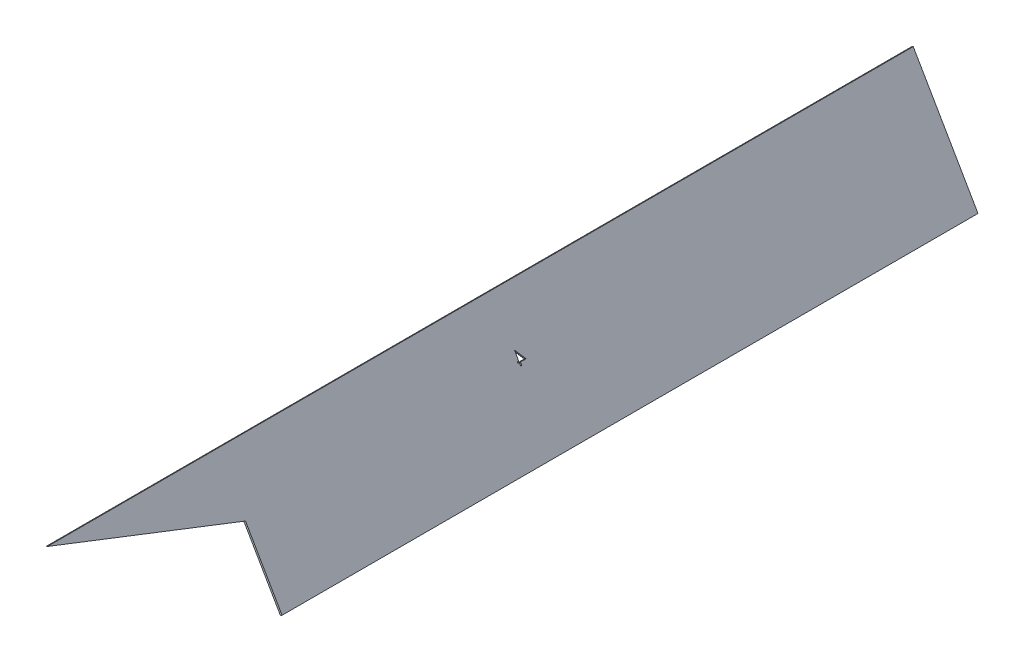
ISO-10303-21;
HEADER;
FILE_DESCRIPTION(('STEP AP214'),'2;1');
FILE_NAME('part.step','',(''),(''),'','','');
FILE_SCHEMA(('AUTOMOTIVE_DESIGN { 1 0 10303 214 1 1 1 1 }'));
ENDSEC;
DATA;
#1=APPLICATION_CONTEXT('core data for automotive mechanical design processes');
#2=APPLICATION_PROTOCOL_DEFINITION('international standard','automotive_design',2000,#1);
#3=PRODUCT_CONTEXT('',#1,'mechanical');
#4=PRODUCT('Part','Part','',(#3));
#5=PRODUCT_RELATED_PRODUCT_CATEGORY('part','',(#4));
#6=PRODUCT_DEFINITION_FORMATION('','',#4);
#7=PRODUCT_DEFINITION_CONTEXT('part definition',#1,'design');
#8=PRODUCT_DEFINITION('design','',#6,#7);
#9=PRODUCT_DEFINITION_SHAPE('','',#8);
#10=(LENGTH_UNIT() NAMED_UNIT(*) SI_UNIT(.MILLI.,.METRE.));
#11=(NAMED_UNIT(*) PLANE_ANGLE_UNIT() SI_UNIT($,.RADIAN.));
#12=(NAMED_UNIT(*) SI_UNIT($,.STERADIAN.) SOLID_ANGLE_UNIT());
#13=UNCERTAINTY_MEASURE_WITH_UNIT(LENGTH_MEASURE(1.E-05),#10,'distance_accuracy_value','');
#14=(GEOMETRIC_REPRESENTATION_CONTEXT(3) GLOBAL_UNCERTAINTY_ASSIGNED_CONTEXT((#13)) GLOBAL_UNIT_ASSIGNED_CONTEXT((#10,
#11,#12)) REPRESENTATION_CONTEXT('',''));
#15=CARTESIAN_POINT('',(0.,0.,0.));
#16=DIRECTION('',(0.,0.,1.));
#17=DIRECTION('',(1.,0.,0.));
#18=AXIS2_PLACEMENT_3D('',#15,#16,#17);
#19=CARTESIAN_POINT('',(-67.0289758800938,116.097591803631,-17.4864379112932));
#20=DIRECTION('',(0.,0.,1.));
#21=DIRECTION('',(0.500000000000001,-0.866025403784438,0.));
#22=AXIS2_PLACEMENT_3D('',#19,#20,#21);
#23=PLANE('',#22);
#24=DIRECTION('',(-0.866025403784438,-0.500000000000001,0.));
#25=VECTOR('',#24,1.);
#26=CARTESIAN_POINT('',(-67.0289758800938,116.097591803631,-17.4864379112932));
#27=LINE('',#26,#25);
#28=CARTESIAN_POINT('',(-64.2793452230782,117.685091803631,-17.4864379112931));
#29=VERTEX_POINT('',#28);
#30=CARTESIAN_POINT('',(-67.0289758800938,116.097591803631,-17.4864379112932));
#31=VERTEX_POINT('',#30);
#32=EDGE_CURVE('E11',#29,#31,#27,.T.);
#33=ORIENTED_EDGE('',*,*,#32,.F.);
#34=DIRECTION('',(-0.500000000000001,0.866025403784438,0.));
#35=VECTOR('',#34,1.);
#36=CARTESIAN_POINT('',(2.74963065701559,1.5875,-17.4864379112931));
#37=LINE('',#36,#35);
#38=CARTESIAN_POINT('',(-57.6851144538474,106.263549074489,-17.4864379112931));
#39=VERTEX_POINT('',#38);
#40=EDGE_CURVE('E145',#29,#39,#37,.F.);
#41=ORIENTED_EDGE('',*,*,#40,.T.);
#42=DIRECTION('',(-0.866025403784438,-0.500000000000001,0.));
#43=VECTOR('',#42,1.);
#44=CARTESIAN_POINT('',(-60.434745110863,104.676049074489,-17.4864379112932));
#45=LINE('',#44,#43);
#46=CARTESIAN_POINT('',(-60.434745110863,104.676049074489,-17.4864379112932));
#47=VERTEX_POINT('',#46);
#48=EDGE_CURVE('E62',#39,#47,#45,.T.);
#49=ORIENTED_EDGE('',*,*,#48,.T.);
#50=DIRECTION('',(0.500000000000001,-0.866025403784438,0.));
#51=VECTOR('',#50,1.);
#52=CARTESIAN_POINT('',(-67.0289758800938,116.097591803631,-17.4864379112932));
#53=LINE('',#52,#51);
#54=EDGE_CURVE('E244',#31,#47,#53,.T.);
#55=ORIENTED_EDGE('',*,*,#54,.F.);
#56=EDGE_LOOP('',(#33,#41,#49,#55));
#57=FACE_BOUND('',#56,.T.);
#58=ADVANCED_FACE('F51',(#57),#23,.F.);
#59=CARTESIAN_POINT('',(-60.434745110863,104.676049074489,-17.4864379112932));
#60=DIRECTION('',(-0.500000000000001,0.866025403784438,0.));
#61=DIRECTION('',(0.,0.,1.));
#62=AXIS2_PLACEMENT_3D('',#59,#60,#61);
#63=PLANE('',#62);
#64=ORIENTED_EDGE('',*,*,#48,.F.);
#65=DIRECTION('',(0.,0.,1.));
#66=VECTOR('',#65,1.);
#67=CARTESIAN_POINT('',(-57.6851144538474,106.263549074489,701.675));
#68=LINE('',#67,#66);
#69=CARTESIAN_POINT('',(-57.6851144538474,106.263549074489,-15.2883609882163));
#70=VERTEX_POINT('',#69);
#71=EDGE_CURVE('E184',#39,#70,#68,.T.);
#72=ORIENTED_EDGE('',*,*,#71,.T.);
#73=DIRECTION('',(-0.866025403784438,-0.500000000000001,0.));
#74=VECTOR('',#73,1.);
#75=CARTESIAN_POINT('',(-60.434745110863,104.676049074489,-15.2883609882162));
#76=LINE('',#75,#74);
#77=CARTESIAN_POINT('',(-60.434745110863,104.676049074489,-15.2883609882162));
#78=VERTEX_POINT('',#77);
#79=EDGE_CURVE('E235',#70,#78,#76,.T.);
#80=ORIENTED_EDGE('',*,*,#79,.T.);
#81=DIRECTION('',(0.,0.,1.));
#82=VECTOR('',#81,1.);
#83=CARTESIAN_POINT('',(-60.434745110863,104.676049074489,-17.4864379112932));
#84=LINE('',#83,#82);
#85=EDGE_CURVE('E253',#47,#78,#84,.T.);
#86=ORIENTED_EDGE('',*,*,#85,.F.);
#87=EDGE_LOOP('',(#64,#72,#80,#86));
#88=FACE_BOUND('',#87,.T.);
#89=ADVANCED_FACE('F257',(#88),#63,.F.);
#90=CARTESIAN_POINT('',(-60.434745110863,104.676049074489,-15.2883609882162));
#91=DIRECTION('',(0.,0.,1.));
#92=DIRECTION('',(0.5,-0.866025403784438,0.));
#93=AXIS2_PLACEMENT_3D('',#90,#91,#92);
#94=PLANE('',#93);
#95=ORIENTED_EDGE('',*,*,#79,.F.);
#96=DIRECTION('',(-0.500000000000001,0.866025403784438,0.));
#97=VECTOR('',#96,1.);
#98=CARTESIAN_POINT('',(2.74963065701559,1.5875,-15.2883609882163));
#99=LINE('',#98,#97);
#100=CARTESIAN_POINT('',(-56.7081913769243,104.571468670172,-15.2883609882163));
#101=VERTEX_POINT('',#100);
#102=EDGE_CURVE('E180',#70,#101,#99,.F.);
#103=ORIENTED_EDGE('',*,*,#102,.T.);
#104=DIRECTION('',(-0.866025403784438,-0.500000000000001,0.));
#105=VECTOR('',#104,1.);
#106=CARTESIAN_POINT('',(-59.4578220339399,102.983968670172,-15.2883609882162));
#107=LINE('',#106,#105);
#108=CARTESIAN_POINT('',(-59.4578220339399,102.983968670172,-15.2883609882162));
#109=VERTEX_POINT('',#108);
#110=EDGE_CURVE('E231',#101,#109,#107,.T.);
#111=ORIENTED_EDGE('',*,*,#110,.T.);
#112=DIRECTION('',(0.5,-0.866025403784438,0.));
#113=VECTOR('',#112,1.);
#114=CARTESIAN_POINT('',(-60.434745110863,104.676049074489,-15.2883609882162));
#115=LINE('',#114,#113);
#116=EDGE_CURVE('E259',#78,#109,#115,.T.);
#117=ORIENTED_EDGE('',*,*,#116,.F.);
#118=EDGE_LOOP('',(#95,#103,#111,#117));
#119=FACE_BOUND('',#118,.T.);
#120=ADVANCED_FACE('F395',(#119),#94,.F.);
#121=CARTESIAN_POINT('',(-59.4578220339399,102.983968670172,-15.2883609882162));
#122=DIRECTION('',(0.500000000000001,-0.866025403784438,0.));
#123=DIRECTION('',(0.,0.,-1.));
#124=AXIS2_PLACEMENT_3D('',#121,#122,#123);
#125=PLANE('',#124);
#126=ORIENTED_EDGE('',*,*,#110,.F.);
#127=DIRECTION('',(0.,0.,1.));
#128=VECTOR('',#127,1.);
#129=CARTESIAN_POINT('',(-56.7081913769243,104.571468670172,701.675));
#130=LINE('',#129,#128);
#131=CARTESIAN_POINT('',(-56.7081913769243,104.571468670172,-17.4864379112931));
#132=VERTEX_POINT('',#131);
#133=EDGE_CURVE('E176',#101,#132,#130,.F.);
#134=ORIENTED_EDGE('',*,*,#133,.T.);
#135=DIRECTION('',(-0.866025403784438,-0.500000000000001,0.));
#136=VECTOR('',#135,1.);
#137=CARTESIAN_POINT('',(-59.4578220339399,102.983968670172,-17.4864379112932));
#138=LINE('',#137,#136);
#139=CARTESIAN_POINT('',(-59.4578220339399,102.983968670172,-17.4864379112932));
#140=VERTEX_POINT('',#139);
#141=EDGE_CURVE('E227',#132,#140,#138,.T.);
#142=ORIENTED_EDGE('',*,*,#141,.T.);
#143=DIRECTION('',(0.,0.,-1.));
#144=VECTOR('',#143,1.);
#145=CARTESIAN_POINT('',(-59.4578220339399,102.983968670172,-15.2883609882162));
#146=LINE('',#145,#144);
#147=EDGE_CURVE('E262',#109,#140,#146,.T.);
#148=ORIENTED_EDGE('',*,*,#147,.F.);
#149=EDGE_LOOP('',(#126,#134,#142,#148));
#150=FACE_BOUND('',#149,.T.);
#151=ADVANCED_FACE('F400',(#150),#125,.F.);
#152=CARTESIAN_POINT('',(-59.4578220339399,102.983968670172,-17.4864379112932));
#153=DIRECTION('',(0.,0.,1.));
#154=DIRECTION('',(0.500000000000002,-0.866025403784437,0.));
#155=AXIS2_PLACEMENT_3D('',#152,#153,#154);
#156=PLANE('',#155);
#157=ORIENTED_EDGE('',*,*,#141,.F.);
#158=DIRECTION('',(-0.500000000000001,0.866025403784438,0.));
#159=VECTOR('',#158,1.);
#160=CARTESIAN_POINT('',(2.74963065701559,1.5875,-17.4864379112931));
#161=LINE('',#160,#159);
#162=CARTESIAN_POINT('',(-54.5101144538474,100.764287760458,-17.4864379112931));
#163=VERTEX_POINT('',#162);
#164=EDGE_CURVE('E172',#132,#163,#161,.F.);
#165=ORIENTED_EDGE('',*,*,#164,.T.);
#166=DIRECTION('',(-0.866025403784438,-0.500000000000001,0.));
#167=VECTOR('',#166,1.);
#168=CARTESIAN_POINT('',(-57.259745110863,99.1767877604579,-17.4864379112932));
#169=LINE('',#168,#167);
#170=CARTESIAN_POINT('',(-57.259745110863,99.1767877604579,-17.4864379112932));
#171=VERTEX_POINT('',#170);
#172=EDGE_CURVE('E223',#163,#171,#169,.T.);
#173=ORIENTED_EDGE('',*,*,#172,.T.);
#174=DIRECTION('',(0.500000000000002,-0.866025403784437,0.));
#175=VECTOR('',#174,1.);
#176=CARTESIAN_POINT('',(-59.4578220339399,102.983968670172,-17.4864379112932));
#177=LINE('',#176,#175);
#178=EDGE_CURVE('E269',#140,#171,#177,.T.);
#179=ORIENTED_EDGE('',*,*,#178,.F.);
#180=EDGE_LOOP('',(#157,#165,#173,#179));
#181=FACE_BOUND('',#180,.T.);
#182=ADVANCED_FACE('F404',(#181),#156,.F.);
#183=CARTESIAN_POINT('',(-57.259745110863,99.1767877604579,-17.4864379112932));
#184=DIRECTION('',(0.500000000000001,-0.866025403784438,0.));
#185=DIRECTION('',(0.,0.,-1.));
#186=AXIS2_PLACEMENT_3D('',#183,#184,#185);
#187=PLANE('',#186);
#188=ORIENTED_EDGE('',*,*,#172,.F.);
#189=DIRECTION('',(0.,0.,1.));
#190=VECTOR('',#189,1.);
#191=CARTESIAN_POINT('',(-54.5101144538474,100.764287760458,701.675));
#192=LINE('',#191,#190);
#193=CARTESIAN_POINT('',(-54.5101144538474,100.764287760458,-19.1960532959086));
#194=VERTEX_POINT('',#193);
#195=EDGE_CURVE('E168',#163,#194,#192,.F.);
#196=ORIENTED_EDGE('',*,*,#195,.T.);
#197=DIRECTION('',(-0.866025403784438,-0.500000000000001,0.));
#198=VECTOR('',#197,1.);
#199=CARTESIAN_POINT('',(-57.259745110863,99.1767877604579,-19.1960532959086));
#200=LINE('',#199,#198);
#201=CARTESIAN_POINT('',(-57.259745110863,99.1767877604579,-19.1960532959086));
#202=VERTEX_POINT('',#201);
#203=EDGE_CURVE('E219',#194,#202,#200,.T.);
#204=ORIENTED_EDGE('',*,*,#203,.T.);
#205=DIRECTION('',(0.,0.,-1.));
#206=VECTOR('',#205,1.);
#207=CARTESIAN_POINT('',(-57.259745110863,99.1767877604579,-17.4864379112932));
#208=LINE('',#207,#206);
#209=EDGE_CURVE('E273',#171,#202,#208,.T.);
#210=ORIENTED_EDGE('',*,*,#209,.F.);
#211=EDGE_LOOP('',(#188,#196,#204,#210));
#212=FACE_BOUND('',#211,.T.);
#213=ADVANCED_FACE('F333',(#212),#187,.F.);
#214=CARTESIAN_POINT('',(-57.259745110863,99.1767877604579,-19.1960532959086));
#215=DIRECTION('',(0.,0.,-1.));
#216=DIRECTION('',(-0.500000000000002,0.866025403784437,0.));
#217=AXIS2_PLACEMENT_3D('',#214,#215,#216);
#218=PLANE('',#217);
#219=ORIENTED_EDGE('',*,*,#203,.F.);
#220=DIRECTION('',(-0.500000000000001,0.866025403784438,0.));
#221=VECTOR('',#220,1.);
#222=CARTESIAN_POINT('',(2.74963065701559,1.5875,-19.1960532959086));
#223=LINE('',#222,#221);
#224=CARTESIAN_POINT('',(-56.7081913769243,104.571468670172,-19.1960532959086));
#225=VERTEX_POINT('',#224);
#226=EDGE_CURVE('E164',#194,#225,#223,.T.);
#227=ORIENTED_EDGE('',*,*,#226,.T.);
#228=DIRECTION('',(-0.866025403784438,-0.500000000000001,0.));
#229=VECTOR('',#228,1.);
#230=CARTESIAN_POINT('',(-59.4578220339399,102.983968670172,-19.1960532959086));
#231=LINE('',#230,#229);
#232=CARTESIAN_POINT('',(-59.4578220339399,102.983968670172,-19.1960532959086));
#233=VERTEX_POINT('',#232);
#234=EDGE_CURVE('E216',#225,#233,#231,.T.);
#235=ORIENTED_EDGE('',*,*,#234,.T.);
#236=DIRECTION('',(-0.500000000000002,0.866025403784437,0.));
#237=VECTOR('',#236,1.);
#238=CARTESIAN_POINT('',(-57.259745110863,99.1767877604579,-19.1960532959086));
#239=LINE('',#238,#237);
#240=EDGE_CURVE('E277',#202,#233,#239,.T.);
#241=ORIENTED_EDGE('',*,*,#240,.F.);
#242=EDGE_LOOP('',(#219,#227,#235,#241));
#243=FACE_BOUND('',#242,.T.);
#244=ADVANCED_FACE('F339',(#243),#218,.F.);
#245=CARTESIAN_POINT('',(-59.4578220339399,102.983968670172,-19.1960532959086));
#246=DIRECTION('',(0.500000000000001,-0.866025403784438,0.));
#247=DIRECTION('',(0.,0.,-1.));
#248=AXIS2_PLACEMENT_3D('',#245,#246,#247);
#249=PLANE('',#248);
#250=ORIENTED_EDGE('',*,*,#234,.F.);
#251=DIRECTION('',(0.,0.,1.));
#252=VECTOR('',#251,1.);
#253=CARTESIAN_POINT('',(-56.7081913769243,104.571468670172,701.675));
#254=LINE('',#253,#252);
#255=CARTESIAN_POINT('',(-56.7081913769243,104.571468670172,-28.232591757447));
#256=VERTEX_POINT('',#255);
#257=EDGE_CURVE('E160',#225,#256,#254,.F.);
#258=ORIENTED_EDGE('',*,*,#257,.T.);
#259=DIRECTION('',(-0.866025403784438,-0.500000000000001,0.));
#260=VECTOR('',#259,1.);
#261=CARTESIAN_POINT('',(-59.4578220339399,102.983968670172,-28.232591757447));
#262=LINE('',#261,#260);
#263=CARTESIAN_POINT('',(-59.4578220339399,102.983968670172,-28.232591757447));
#264=VERTEX_POINT('',#263);
#265=EDGE_CURVE('E70',#256,#264,#262,.T.);
#266=ORIENTED_EDGE('',*,*,#265,.T.);
#267=DIRECTION('',(0.,0.,-1.));
#268=VECTOR('',#267,1.);
#269=CARTESIAN_POINT('',(-59.4578220339399,102.983968670172,-19.1960532959086));
#270=LINE('',#269,#268);
#271=EDGE_CURVE('E213',#233,#264,#270,.T.);
#272=ORIENTED_EDGE('',*,*,#271,.F.);
#273=EDGE_LOOP('',(#250,#258,#266,#272));
#274=FACE_BOUND('',#273,.T.);
#275=ADVANCED_FACE('F340',(#274),#249,.F.);
#276=CARTESIAN_POINT('',(-59.4578220339399,102.983968670172,-28.232591757447));
#277=DIRECTION('',(-0.283052771596604,0.490261781628506,-0.824332768950697));
#278=DIRECTION('',(-0.41216638447535,0.713893119083271,0.566105543193207));
#279=AXIS2_PLACEMENT_3D('',#276,#277,#278);
#280=PLANE('',#279);
#281=ORIENTED_EDGE('',*,*,#265,.F.);
#282=DIRECTION('',(-0.41216638447535,0.713893119083271,0.566105543193207));
#283=VECTOR('',#282,1.);
#284=CARTESIAN_POINT('',(-56.7081913769243,104.571468670172,-28.232591757447));
#285=LINE('',#284,#283);
#286=CARTESIAN_POINT('',(-64.2793452230782,117.685091803631,-17.8337035362932));
#287=VERTEX_POINT('',#286);
#288=EDGE_CURVE('E143',#256,#287,#285,.T.);
#289=ORIENTED_EDGE('',*,*,#288,.T.);
#290=DIRECTION('',(-0.866025403784438,-0.500000000000001,0.));
#291=VECTOR('',#290,1.);
#292=CARTESIAN_POINT('',(-67.0289758800938,116.097591803631,-17.8337035362932));
#293=LINE('',#292,#291);
#294=CARTESIAN_POINT('',(-67.0289758800938,116.097591803631,-17.8337035362932));
#295=VERTEX_POINT('',#294);
#296=EDGE_CURVE('E55',#287,#295,#293,.T.);
#297=ORIENTED_EDGE('',*,*,#296,.T.);
#298=DIRECTION('',(-0.41216638447535,0.713893119083271,0.566105543193207));
#299=VECTOR('',#298,1.);
#300=CARTESIAN_POINT('',(-59.4578220339399,102.983968670172,-28.232591757447));
#301=LINE('',#300,#299);
#302=EDGE_CURVE('E341',#264,#295,#301,.T.);
#303=ORIENTED_EDGE('',*,*,#302,.F.);
#304=EDGE_LOOP('',(#281,#289,#297,#303));
#305=FACE_BOUND('',#304,.T.);
#306=ADVANCED_FACE('F148',(#305),#280,.F.);
#307=CARTESIAN_POINT('',(-105.,181.865334794732,701.675));
#308=DIRECTION('',(0.500000000000001,-0.866025403784438,0.));
#309=DIRECTION('',(0.,0.,-1.));
#310=AXIS2_PLACEMENT_3D('',#307,#308,#309);
#311=PLANE('',#310);
#312=DIRECTION('',(-0.866025403784438,-0.500000000000001,0.));
#313=VECTOR('',#312,1.);
#314=CARTESIAN_POINT('',(-105.,181.865334794732,701.675));
#315=LINE('',#314,#313);
#316=CARTESIAN_POINT('',(-102.250369342985,183.452834794732,701.675));
#317=VERTEX_POINT('',#316);
#318=CARTESIAN_POINT('',(-105.,181.865334794732,701.675));
#319=VERTEX_POINT('',#318);
#320=EDGE_CURVE('E138',#317,#319,#315,.T.);
#321=ORIENTED_EDGE('',*,*,#320,.F.);
#322=DIRECTION('',(0.,0.,1.));
#323=VECTOR('',#322,1.);
#324=CARTESIAN_POINT('',(-102.250369342985,183.452834794732,701.675));
#325=LINE('',#324,#323);
#326=CARTESIAN_POINT('',(-102.250369342985,183.452834794732,-701.675));
#327=VERTEX_POINT('',#326);
#328=EDGE_CURVE('E294',#317,#327,#325,.F.);
#329=ORIENTED_EDGE('',*,*,#328,.T.);
#330=DIRECTION('',(-0.866025403784438,-0.500000000000001,0.));
#331=VECTOR('',#330,1.);
#332=CARTESIAN_POINT('',(-105.,181.865334794732,-701.675));
#333=LINE('',#332,#331);
#334=CARTESIAN_POINT('',(-105.,181.865334794732,-701.675));
#335=VERTEX_POINT('',#334);
#336=EDGE_CURVE('E203',#327,#335,#333,.T.);
#337=ORIENTED_EDGE('',*,*,#336,.T.);
#338=DIRECTION('',(0.,0.,-1.));
#339=VECTOR('',#338,1.);
#340=CARTESIAN_POINT('',(-105.,181.865334794732,701.675));
#341=LINE('',#340,#339);
#342=EDGE_CURVE('E356',#319,#335,#341,.T.);
#343=ORIENTED_EDGE('',*,*,#342,.F.);
#344=EDGE_LOOP('',(#321,#329,#337,#343));
#345=FACE_BOUND('',#344,.T.);
#346=ADVANCED_FACE('F374',(#345),#311,.F.);
#347=CARTESIAN_POINT('',(0.,0.,-701.675));
#348=DIRECTION('',(0.,0.,1.));
#349=DIRECTION('',(0.500000000000001,-0.866025403784438,0.));
#350=AXIS2_PLACEMENT_3D('',#347,#348,#349);
#351=PLANE('',#350);
#352=ORIENTED_EDGE('',*,*,#336,.F.);
#353=DIRECTION('',(-0.500000000000001,0.866025403784438,0.));
#354=VECTOR('',#353,1.);
#355=CARTESIAN_POINT('',(2.74963065701559,1.5875,-701.675));
#356=LINE('',#355,#354);
#357=CARTESIAN_POINT('',(2.74963065701559,1.5875,-701.675));
#358=VERTEX_POINT('',#357);
#359=EDGE_CURVE('E291',#327,#358,#356,.F.);
#360=ORIENTED_EDGE('',*,*,#359,.T.);
#361=DIRECTION('',(-0.866025403784438,-0.500000000000001,0.));
#362=VECTOR('',#361,1.);
#363=CARTESIAN_POINT('',(0.,0.,-701.675));
#364=LINE('',#363,#362);
#365=CARTESIAN_POINT('',(0.,0.,-701.675));
#366=VERTEX_POINT('',#365);
#367=EDGE_CURVE('E199',#358,#366,#364,.T.);
#368=ORIENTED_EDGE('',*,*,#367,.T.);
#369=DIRECTION('',(0.500000000000001,-0.866025403784438,0.));
#370=VECTOR('',#369,1.);
#371=CARTESIAN_POINT('',(0.,0.,-701.675));
#372=LINE('',#371,#370);
#373=EDGE_CURVE('E352',#335,#366,#372,.T.);
#374=ORIENTED_EDGE('',*,*,#373,.F.);
#375=EDGE_LOOP('',(#352,#360,#368,#374));
#376=FACE_BOUND('',#375,.T.);
#377=ADVANCED_FACE('F377',(#376),#351,.F.);
#378=CARTESIAN_POINT('',(0.,0.,701.675));
#379=DIRECTION('',(0.500000000000001,-0.866025403784438,0.));
#380=DIRECTION('',(0.,0.,-1.));
#381=AXIS2_PLACEMENT_3D('',#378,#379,#380);
#382=PLANE('',#381);
#383=ORIENTED_EDGE('',*,*,#367,.F.);
#384=DIRECTION('',(0.,0.,1.));
#385=VECTOR('',#384,1.);
#386=CARTESIAN_POINT('',(2.74963065701559,1.5875,701.675));
#387=LINE('',#386,#385);
#388=CARTESIAN_POINT('',(2.74963065701559,1.5875,426.675));
#389=VERTEX_POINT('',#388);
#390=EDGE_CURVE('E154',#389,#358,#387,.F.);
#391=ORIENTED_EDGE('',*,*,#390,.F.);
#392=DIRECTION('',(-0.866025403784438,-0.500000000000001,0.));
#393=VECTOR('',#392,1.);
#394=CARTESIAN_POINT('',(0.,0.,426.675));
#395=LINE('',#394,#393);
#396=CARTESIAN_POINT('',(0.,0.,426.675));
#397=VERTEX_POINT('',#396);
#398=EDGE_CURVE('E194',#389,#397,#395,.T.);
#399=ORIENTED_EDGE('',*,*,#398,.T.);
#400=DIRECTION('',(0.,0.,-1.));
#401=VECTOR('',#400,1.);
#402=CARTESIAN_POINT('',(0.,0.,701.675));
#403=LINE('',#402,#401);
#404=EDGE_CURVE('E346',#397,#366,#403,.T.);
#405=ORIENTED_EDGE('',*,*,#404,.T.);
#406=EDGE_LOOP('',(#383,#391,#399,#405));
#407=FACE_BOUND('',#406,.T.);
#408=ADVANCED_FACE('F380',(#407),#382,.T.);
#409=CARTESIAN_POINT('',(0.,0.,426.675));
#410=DIRECTION('',(0.,0.,-1.));
#411=DIRECTION('',(-0.500000000000001,0.866025403784438,0.));
#412=AXIS2_PLACEMENT_3D('',#409,#410,#411);
#413=PLANE('',#412);
#414=ORIENTED_EDGE('',*,*,#398,.F.);
#415=DIRECTION('',(-0.500000000000001,0.866025403784438,0.));
#416=VECTOR('',#415,1.);
#417=CARTESIAN_POINT('',(2.74963065701559,1.5875,426.675));
#418=LINE('',#417,#416);
#419=CARTESIAN_POINT('',(-56.5442419887591,104.2875,426.675));
#420=VERTEX_POINT('',#419);
#421=EDGE_CURVE('E150',#389,#420,#418,.T.);
#422=ORIENTED_EDGE('',*,*,#421,.T.);
#423=DIRECTION('',(-0.866025403784438,-0.500000000000001,0.));
#424=VECTOR('',#423,1.);
#425=CARTESIAN_POINT('',(-59.2938726457747,102.7,426.675));
#426=LINE('',#425,#424);
#427=CARTESIAN_POINT('',(-59.2938726457747,102.7,426.675));
#428=VERTEX_POINT('',#427);
#429=EDGE_CURVE('E190',#420,#428,#426,.T.);
#430=ORIENTED_EDGE('',*,*,#429,.T.);
#431=DIRECTION('',(-0.500000000000001,0.866025403784438,0.));
#432=VECTOR('',#431,1.);
#433=CARTESIAN_POINT('',(0.,0.,426.675));
#434=LINE('',#433,#432);
#435=EDGE_CURVE('E317',#397,#428,#434,.T.);
#436=ORIENTED_EDGE('',*,*,#435,.F.);
#437=EDGE_LOOP('',(#414,#422,#430,#436));
#438=FACE_BOUND('',#437,.T.);
#439=ADVANCED_FACE('F315',(#438),#413,.F.);
#440=CARTESIAN_POINT('',(-94.5056897461453,163.688656244664,638.977284395983));
#441=DIRECTION('',(0.474571695561021,-0.821982288545795,0.314844125067238));
#442=DIRECTION('',(0.15742206253362,-0.272663010540513,-0.94914339112204));
#443=AXIS2_PLACEMENT_3D('',#440,#441,#442);
#444=PLANE('',#443);
#445=ORIENTED_EDGE('',*,*,#429,.F.);
#446=DIRECTION('',(0.15742206253362,-0.272663010540513,-0.94914339112204));
#447=VECTOR('',#446,1.);
#448=CARTESIAN_POINT('',(-91.7560590891297,165.276156244664,638.977284395983));
#449=LINE('',#448,#447);
#450=CARTESIAN_POINT('',(-102.15491325474,183.2875,701.675));
#451=VERTEX_POINT('',#450);
#452=EDGE_CURVE('E284',#451,#420,#449,.T.);
#453=ORIENTED_EDGE('',*,*,#452,.F.);
#454=DIRECTION('',(-0.866025403784438,-0.500000000000001,0.));
#455=VECTOR('',#454,1.);
#456=CARTESIAN_POINT('',(-104.904543911755,181.7,701.675));
#457=LINE('',#456,#455);
#458=CARTESIAN_POINT('',(-104.904543911755,181.7,701.675));
#459=VERTEX_POINT('',#458);
#460=EDGE_CURVE('E195',#451,#459,#457,.T.);
#461=ORIENTED_EDGE('',*,*,#460,.T.);
#462=DIRECTION('',(0.15742206253362,-0.272663010540513,-0.94914339112204));
#463=VECTOR('',#462,1.);
#464=CARTESIAN_POINT('',(-94.5056897461453,163.688656244664,638.977284395983));
#465=LINE('',#464,#463);
#466=EDGE_CURVE('E163',#459,#428,#465,.T.);
#467=ORIENTED_EDGE('',*,*,#466,.T.);
#468=EDGE_LOOP('',(#445,#453,#461,#467));
#469=FACE_BOUND('',#468,.T.);
#470=ADVANCED_FACE('F308',(#469),#444,.T.);
#471=CARTESIAN_POINT('',(0.,0.,701.675));
#472=DIRECTION('',(0.,0.,1.));
#473=DIRECTION('',(0.500000000000001,-0.866025403784438,0.));
#474=AXIS2_PLACEMENT_3D('',#471,#472,#473);
#475=PLANE('',#474);
#476=DIRECTION('',(-0.500000000000001,0.866025403784438,0.));
#477=VECTOR('',#476,1.);
#478=CARTESIAN_POINT('',(2.74963065701559,1.5875,701.675));
#479=LINE('',#478,#477);
#480=EDGE_CURVE('E158',#317,#451,#479,.F.);
#481=ORIENTED_EDGE('',*,*,#480,.F.);
#482=ORIENTED_EDGE('',*,*,#320,.T.);
#483=DIRECTION('',(0.500000000000001,-0.866025403784438,0.));
#484=VECTOR('',#483,1.);
#485=CARTESIAN_POINT('',(0.,0.,701.675));
#486=LINE('',#485,#484);
#487=EDGE_CURVE('E360',#319,#459,#486,.T.);
#488=ORIENTED_EDGE('',*,*,#487,.T.);
#489=ORIENTED_EDGE('',*,*,#460,.F.);
#490=EDGE_LOOP('',(#481,#482,#488,#489));
#491=FACE_BOUND('',#490,.T.);
#492=ADVANCED_FACE('F366',(#491),#475,.T.);
#493=CARTESIAN_POINT('',(-67.0289758800938,116.097591803631,-17.8337035362932));
#494=DIRECTION('',(-0.500000000000001,0.866025403784438,0.));
#495=DIRECTION('',(0.,0.,1.));
#496=AXIS2_PLACEMENT_3D('',#493,#494,#495);
#497=PLANE('',#496);
#498=DIRECTION('',(0.,0.,1.));
#499=VECTOR('',#498,1.);
#500=CARTESIAN_POINT('',(-64.2793452230782,117.685091803631,701.675));
#501=LINE('',#500,#499);
#502=EDGE_CURVE('E130',#287,#29,#501,.T.);
#503=ORIENTED_EDGE('',*,*,#502,.T.);
#504=ORIENTED_EDGE('',*,*,#32,.T.);
#505=DIRECTION('',(0.,0.,1.));
#506=VECTOR('',#505,1.);
#507=CARTESIAN_POINT('',(-67.0289758800938,116.097591803631,-17.8337035362932));
#508=LINE('',#507,#506);
#509=EDGE_CURVE('E133',#295,#31,#508,.T.);
#510=ORIENTED_EDGE('',*,*,#509,.F.);
#511=ORIENTED_EDGE('',*,*,#296,.F.);
#512=EDGE_LOOP('',(#503,#504,#510,#511));
#513=FACE_BOUND('',#512,.T.);
#514=ADVANCED_FACE('F53',(#513),#497,.F.);
#515=CARTESIAN_POINT('',(0.,0.,701.675));
#516=DIRECTION('',(0.866025403784438,0.500000000000001,0.));
#517=DIRECTION('',(-0.500000000000001,0.866025403784438,0.));
#518=AXIS2_PLACEMENT_3D('',#515,#516,#517);
#519=PLANE('',#518);
#520=ORIENTED_EDGE('',*,*,#466,.F.);
#521=ORIENTED_EDGE('',*,*,#487,.F.);
#522=ORIENTED_EDGE('',*,*,#342,.T.);
#523=ORIENTED_EDGE('',*,*,#373,.T.);
#524=ORIENTED_EDGE('',*,*,#404,.F.);
#525=ORIENTED_EDGE('',*,*,#435,.T.);
#526=EDGE_LOOP('',(#520,#521,#522,#523,#524,#525));
#527=FACE_BOUND('',#526,.T.);
#528=ORIENTED_EDGE('',*,*,#302,.T.);
#529=ORIENTED_EDGE('',*,*,#509,.T.);
#530=ORIENTED_EDGE('',*,*,#54,.T.);
#531=ORIENTED_EDGE('',*,*,#85,.T.);
#532=ORIENTED_EDGE('',*,*,#116,.T.);
#533=ORIENTED_EDGE('',*,*,#147,.T.);
#534=ORIENTED_EDGE('',*,*,#178,.T.);
#535=ORIENTED_EDGE('',*,*,#209,.T.);
#536=ORIENTED_EDGE('',*,*,#240,.T.);
#537=ORIENTED_EDGE('',*,*,#271,.T.);
#538=EDGE_LOOP('',(#528,#529,#530,#531,#532,#533,#534,#535,#536,#537));
#539=FACE_BOUND('',#538,.T.);
#540=ADVANCED_FACE('F251',(#527,#539),#519,.F.);
#541=CARTESIAN_POINT('',(2.74963065701559,1.5875,701.675));
#542=DIRECTION('',(0.866025403784438,0.500000000000001,0.));
#543=DIRECTION('',(-0.500000000000001,0.866025403784438,0.));
#544=AXIS2_PLACEMENT_3D('',#541,#542,#543);
#545=PLANE('',#544);
#546=ORIENTED_EDGE('',*,*,#452,.T.);
#547=ORIENTED_EDGE('',*,*,#421,.F.);
#548=ORIENTED_EDGE('',*,*,#390,.T.);
#549=ORIENTED_EDGE('',*,*,#359,.F.);
#550=ORIENTED_EDGE('',*,*,#328,.F.);
#551=ORIENTED_EDGE('',*,*,#480,.T.);
#552=EDGE_LOOP('',(#546,#547,#548,#549,#550,#551));
#553=FACE_BOUND('',#552,.T.);
#554=ORIENTED_EDGE('',*,*,#288,.F.);
#555=ORIENTED_EDGE('',*,*,#257,.F.);
#556=ORIENTED_EDGE('',*,*,#226,.F.);
#557=ORIENTED_EDGE('',*,*,#195,.F.);
#558=ORIENTED_EDGE('',*,*,#164,.F.);
#559=ORIENTED_EDGE('',*,*,#133,.F.);
#560=ORIENTED_EDGE('',*,*,#102,.F.);
#561=ORIENTED_EDGE('',*,*,#71,.F.);
#562=ORIENTED_EDGE('',*,*,#40,.F.);
#563=ORIENTED_EDGE('',*,*,#502,.F.);
#564=EDGE_LOOP('',(#554,#555,#556,#557,#558,#559,#560,#561,#562,#563));
#565=FACE_BOUND('',#564,.T.);
#566=ADVANCED_FACE('F141',(#553,#565),#545,.T.);
#567=CLOSED_SHELL('',(#58,#89,#120,#151,#182,#213,#244,#275,#306,#346,#377,#408,#439,#470,#492,
#514,#540,#566));
#568=MANIFOLD_SOLID_BREP('B2',#567);
#569=ADVANCED_BREP_SHAPE_REPRESENTATION('',(#18,#568),#14);
#570=SHAPE_DEFINITION_REPRESENTATION(#9,#569);
ENDSEC;
END-ISO-10303-21;
